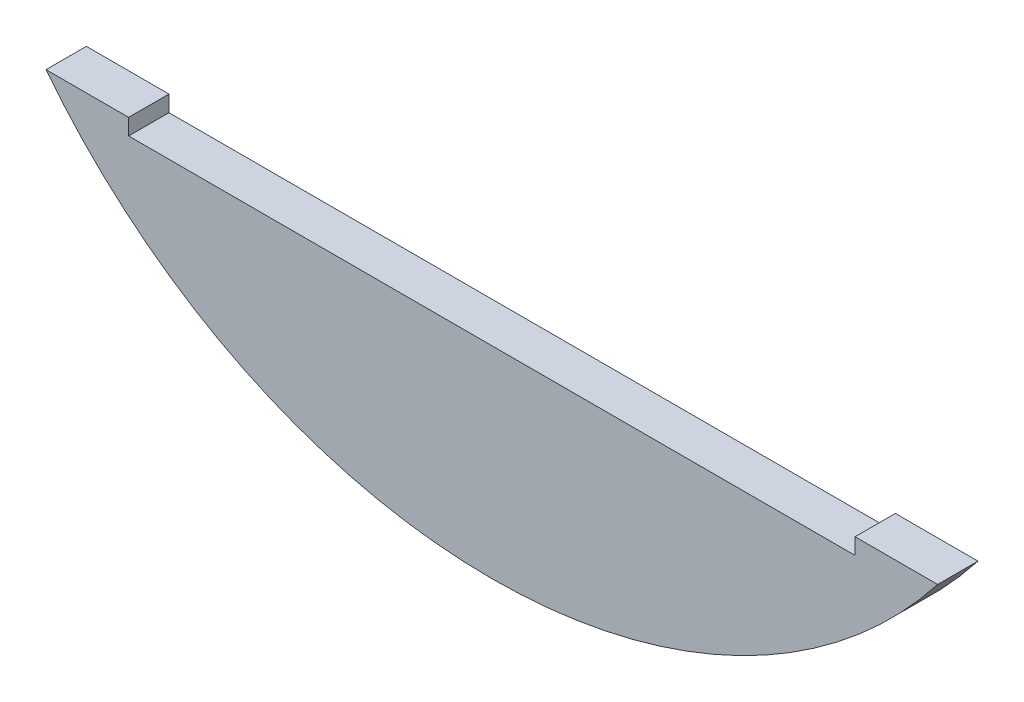
ISO-10303-21;
HEADER;
FILE_DESCRIPTION(('STEP AP214'),'2;1');
FILE_NAME('part.step','',(''),(''),'','','');
FILE_SCHEMA(('AUTOMOTIVE_DESIGN { 1 0 10303 214 1 1 1 1 }'));
ENDSEC;
DATA;
#1=APPLICATION_CONTEXT('core data for automotive mechanical design processes');
#2=APPLICATION_PROTOCOL_DEFINITION('international standard','automotive_design',2000,#1);
#3=PRODUCT_CONTEXT('',#1,'mechanical');
#4=PRODUCT('Part','Part','',(#3));
#5=PRODUCT_RELATED_PRODUCT_CATEGORY('part','',(#4));
#6=PRODUCT_DEFINITION_FORMATION('','',#4);
#7=PRODUCT_DEFINITION_CONTEXT('part definition',#1,'design');
#8=PRODUCT_DEFINITION('design','',#6,#7);
#9=PRODUCT_DEFINITION_SHAPE('','',#8);
#10=(LENGTH_UNIT() NAMED_UNIT(*) SI_UNIT(.MILLI.,.METRE.));
#11=(NAMED_UNIT(*) PLANE_ANGLE_UNIT() SI_UNIT($,.RADIAN.));
#12=(NAMED_UNIT(*) SI_UNIT($,.STERADIAN.) SOLID_ANGLE_UNIT());
#13=UNCERTAINTY_MEASURE_WITH_UNIT(LENGTH_MEASURE(1.E-05),#10,'distance_accuracy_value','');
#14=(GEOMETRIC_REPRESENTATION_CONTEXT(3) GLOBAL_UNCERTAINTY_ASSIGNED_CONTEXT((#13)) GLOBAL_UNIT_ASSIGNED_CONTEXT((#10,
#11,#12)) REPRESENTATION_CONTEXT('',''));
#15=CARTESIAN_POINT('',(0.,0.,0.));
#16=DIRECTION('',(0.,0.,1.));
#17=DIRECTION('',(1.,0.,0.));
#18=AXIS2_PLACEMENT_3D('',#15,#16,#17);
#19=CARTESIAN_POINT('',(0.,0.,5.));
#20=DIRECTION('',(0.,0.,1.));
#21=DIRECTION('',(1.,0.,0.));
#22=AXIS2_PLACEMENT_3D('',#19,#20,#21);
#23=PLANE('',#22);
#24=CARTESIAN_POINT('',(0.,0.,5.));
#25=DIRECTION('',(0.,0.,1.));
#26=DIRECTION('',(1.,0.,0.));
#27=AXIS2_PLACEMENT_3D('',#24,#25,#26);
#28=CIRCLE('',#27,70.);
#29=CARTESIAN_POINT('',(-55.235857918566,-43.,5.));
#30=VERTEX_POINT('',#29);
#31=CARTESIAN_POINT('',(55.235857918566,-43.,5.));
#32=VERTEX_POINT('',#31);
#33=EDGE_CURVE('E99',#30,#32,#28,.T.);
#34=ORIENTED_EDGE('',*,*,#33,.T.);
#35=DIRECTION('',(-1.,0.,0.));
#36=VECTOR('',#35,1.);
#37=CARTESIAN_POINT('',(-55.235857918566,-43.,5.));
#38=LINE('',#37,#36);
#39=CARTESIAN_POINT('',(45.,-43.,5.));
#40=VERTEX_POINT('',#39);
#41=EDGE_CURVE('E108',#32,#40,#38,.T.);
#42=ORIENTED_EDGE('',*,*,#41,.T.);
#43=DIRECTION('',(0.,1.,0.));
#44=VECTOR('',#43,1.);
#45=CARTESIAN_POINT('',(45.,45.,5.));
#46=LINE('',#45,#44);
#47=CARTESIAN_POINT('',(45.,-45.,5.));
#48=VERTEX_POINT('',#47);
#49=EDGE_CURVE('E119',#48,#40,#46,.T.);
#50=ORIENTED_EDGE('',*,*,#49,.F.);
#51=DIRECTION('',(1.,0.,0.));
#52=VECTOR('',#51,1.);
#53=CARTESIAN_POINT('',(45.,-45.,5.));
#54=LINE('',#53,#52);
#55=CARTESIAN_POINT('',(-45.,-45.,5.));
#56=VERTEX_POINT('',#55);
#57=EDGE_CURVE('E116',#56,#48,#54,.T.);
#58=ORIENTED_EDGE('',*,*,#57,.F.);
#59=DIRECTION('',(0.,-1.,0.));
#60=VECTOR('',#59,1.);
#61=CARTESIAN_POINT('',(-45.,-45.,5.));
#62=LINE('',#61,#60);
#63=CARTESIAN_POINT('',(-45.,-43.,5.));
#64=VERTEX_POINT('',#63);
#65=EDGE_CURVE('E107',#64,#56,#62,.T.);
#66=ORIENTED_EDGE('',*,*,#65,.F.);
#67=EDGE_CURVE('E90',#64,#30,#38,.T.);
#68=ORIENTED_EDGE('',*,*,#67,.T.);
#69=EDGE_LOOP('',(#34,#42,#50,#58,#66,#68));
#70=FACE_BOUND('',#69,.T.);
#71=ADVANCED_FACE('F33',(#70),#23,.T.);
#72=CARTESIAN_POINT('',(0.,0.,0.));
#73=DIRECTION('',(0.,0.,1.));
#74=DIRECTION('',(1.,0.,0.));
#75=AXIS2_PLACEMENT_3D('',#72,#73,#74);
#76=PLANE('',#75);
#77=DIRECTION('',(-1.,0.,0.));
#78=VECTOR('',#77,1.);
#79=CARTESIAN_POINT('',(0.,-43.,0.));
#80=LINE('',#79,#78);
#81=CARTESIAN_POINT('',(55.235857918566,-43.,0.));
#82=VERTEX_POINT('',#81);
#83=CARTESIAN_POINT('',(45.,-42.9999999999999,0.));
#84=VERTEX_POINT('',#83);
#85=EDGE_CURVE('E48',#82,#84,#80,.T.);
#86=ORIENTED_EDGE('',*,*,#85,.F.);
#87=CARTESIAN_POINT('',(0.,0.,0.));
#88=DIRECTION('',(0.,0.,1.));
#89=DIRECTION('',(1.,0.,0.));
#90=AXIS2_PLACEMENT_3D('',#87,#88,#89);
#91=CIRCLE('',#90,70.);
#92=CARTESIAN_POINT('',(-55.235857918566,-43.,0.));
#93=VERTEX_POINT('',#92);
#94=EDGE_CURVE('E11',#93,#82,#91,.T.);
#95=ORIENTED_EDGE('',*,*,#94,.F.);
#96=CARTESIAN_POINT('',(-45.,-43.,0.));
#97=VERTEX_POINT('',#96);
#98=EDGE_CURVE('E93',#97,#93,#80,.T.);
#99=ORIENTED_EDGE('',*,*,#98,.F.);
#100=DIRECTION('',(0.,-1.,0.));
#101=VECTOR('',#100,1.);
#102=CARTESIAN_POINT('',(-45.,-45.,0.));
#103=LINE('',#102,#101);
#104=CARTESIAN_POINT('',(-45.,-45.,0.));
#105=VERTEX_POINT('',#104);
#106=EDGE_CURVE('E121',#97,#105,#103,.T.);
#107=ORIENTED_EDGE('',*,*,#106,.T.);
#108=DIRECTION('',(1.,0.,0.));
#109=VECTOR('',#108,1.);
#110=CARTESIAN_POINT('',(45.,-45.,0.));
#111=LINE('',#110,#109);
#112=CARTESIAN_POINT('',(45.,-45.,0.));
#113=VERTEX_POINT('',#112);
#114=EDGE_CURVE('E123',#105,#113,#111,.T.);
#115=ORIENTED_EDGE('',*,*,#114,.T.);
#116=DIRECTION('',(0.,1.,0.));
#117=VECTOR('',#116,1.);
#118=CARTESIAN_POINT('',(45.,45.,0.));
#119=LINE('',#118,#117);
#120=EDGE_CURVE('E117',#113,#84,#119,.T.);
#121=ORIENTED_EDGE('',*,*,#120,.T.);
#122=EDGE_LOOP('',(#86,#95,#99,#107,#115,#121));
#123=FACE_BOUND('',#122,.T.);
#124=ADVANCED_FACE('F35',(#123),#76,.F.);
#125=CARTESIAN_POINT('',(-45.,-45.,5.));
#126=DIRECTION('',(1.,0.,0.));
#127=DIRECTION('',(0.,1.,0.));
#128=AXIS2_PLACEMENT_3D('',#125,#126,#127);
#129=PLANE('',#128);
#130=ORIENTED_EDGE('',*,*,#106,.F.);
#131=DIRECTION('',(0.,0.,1.));
#132=VECTOR('',#131,1.);
#133=CARTESIAN_POINT('',(-45.,-43.,5.));
#134=LINE('',#133,#132);
#135=EDGE_CURVE('E113',#97,#64,#134,.T.);
#136=ORIENTED_EDGE('',*,*,#135,.T.);
#137=ORIENTED_EDGE('',*,*,#65,.T.);
#138=DIRECTION('',(0.,0.,-1.));
#139=VECTOR('',#138,1.);
#140=CARTESIAN_POINT('',(-45.,-45.,5.));
#141=LINE('',#140,#139);
#142=EDGE_CURVE('E129',#56,#105,#141,.T.);
#143=ORIENTED_EDGE('',*,*,#142,.T.);
#144=EDGE_LOOP('',(#130,#136,#137,#143));
#145=FACE_BOUND('',#144,.T.);
#146=ADVANCED_FACE('F151',(#145),#129,.T.);
#147=CARTESIAN_POINT('',(45.,45.,5.));
#148=DIRECTION('',(-1.,0.,0.));
#149=DIRECTION('',(0.,-1.,0.));
#150=AXIS2_PLACEMENT_3D('',#147,#148,#149);
#151=PLANE('',#150);
#152=ORIENTED_EDGE('',*,*,#49,.T.);
#153=DIRECTION('',(0.,0.,-1.));
#154=VECTOR('',#153,1.);
#155=CARTESIAN_POINT('',(45.,-43.,5.));
#156=LINE('',#155,#154);
#157=EDGE_CURVE('E41',#40,#84,#156,.T.);
#158=ORIENTED_EDGE('',*,*,#157,.T.);
#159=ORIENTED_EDGE('',*,*,#120,.F.);
#160=DIRECTION('',(0.,0.,-1.));
#161=VECTOR('',#160,1.);
#162=CARTESIAN_POINT('',(45.,-45.,5.));
#163=LINE('',#162,#161);
#164=EDGE_CURVE('E56',#48,#113,#163,.T.);
#165=ORIENTED_EDGE('',*,*,#164,.F.);
#166=EDGE_LOOP('',(#152,#158,#159,#165));
#167=FACE_BOUND('',#166,.T.);
#168=ADVANCED_FACE('F131',(#167),#151,.T.);
#169=CARTESIAN_POINT('',(45.,-45.,5.));
#170=DIRECTION('',(0.,1.,0.));
#171=DIRECTION('',(-1.,0.,0.));
#172=AXIS2_PLACEMENT_3D('',#169,#170,#171);
#173=PLANE('',#172);
#174=ORIENTED_EDGE('',*,*,#114,.F.);
#175=ORIENTED_EDGE('',*,*,#142,.F.);
#176=ORIENTED_EDGE('',*,*,#57,.T.);
#177=ORIENTED_EDGE('',*,*,#164,.T.);
#178=EDGE_LOOP('',(#174,#175,#176,#177));
#179=FACE_BOUND('',#178,.T.);
#180=ADVANCED_FACE('F138',(#179),#173,.T.);
#181=CARTESIAN_POINT('',(0.,0.,-5.));
#182=DIRECTION('',(0.,0.,1.));
#183=DIRECTION('',(1.,0.,0.));
#184=AXIS2_PLACEMENT_3D('',#181,#182,#183);
#185=CYLINDRICAL_SURFACE('',#184,70.);
#186=ORIENTED_EDGE('',*,*,#94,.T.);
#187=DIRECTION('',(0.,0.,1.));
#188=VECTOR('',#187,1.);
#189=CARTESIAN_POINT('',(55.235857918566,-43.,-5.));
#190=LINE('',#189,#188);
#191=EDGE_CURVE('E96',#82,#32,#190,.T.);
#192=ORIENTED_EDGE('',*,*,#191,.T.);
#193=ORIENTED_EDGE('',*,*,#33,.F.);
#194=DIRECTION('',(0.,0.,1.));
#195=VECTOR('',#194,1.);
#196=CARTESIAN_POINT('',(-55.235857918566,-43.,-5.));
#197=LINE('',#196,#195);
#198=EDGE_CURVE('E86',#93,#30,#197,.T.);
#199=ORIENTED_EDGE('',*,*,#198,.F.);
#200=EDGE_LOOP('',(#186,#192,#193,#199));
#201=FACE_BOUND('',#200,.T.);
#202=ADVANCED_FACE('F100',(#201),#185,.T.);
#203=CARTESIAN_POINT('',(-55.235857918566,-43.,-5.));
#204=DIRECTION('',(0.,1.,0.));
#205=DIRECTION('',(0.,0.,1.));
#206=AXIS2_PLACEMENT_3D('',#203,#204,#205);
#207=PLANE('',#206);
#208=ORIENTED_EDGE('',*,*,#98,.T.);
#209=ORIENTED_EDGE('',*,*,#198,.T.);
#210=ORIENTED_EDGE('',*,*,#67,.F.);
#211=ORIENTED_EDGE('',*,*,#135,.F.);
#212=EDGE_LOOP('',(#208,#209,#210,#211));
#213=FACE_BOUND('',#212,.T.);
#214=ADVANCED_FACE('F88',(#213),#207,.T.);
#215=ORIENTED_EDGE('',*,*,#85,.T.);
#216=ORIENTED_EDGE('',*,*,#157,.F.);
#217=ORIENTED_EDGE('',*,*,#41,.F.);
#218=ORIENTED_EDGE('',*,*,#191,.F.);
#219=EDGE_LOOP('',(#215,#216,#217,#218));
#220=FACE_BOUND('',#219,.T.);
#221=ADVANCED_FACE('F139',(#220),#207,.T.);
#222=CLOSED_SHELL('',(#71,#124,#146,#168,#180,#202,#214,#221));
#223=MANIFOLD_SOLID_BREP('B2',#222);
#224=ADVANCED_BREP_SHAPE_REPRESENTATION('',(#18,#223),#14);
#225=SHAPE_DEFINITION_REPRESENTATION(#9,#224);
ENDSEC;
END-ISO-10303-21;
